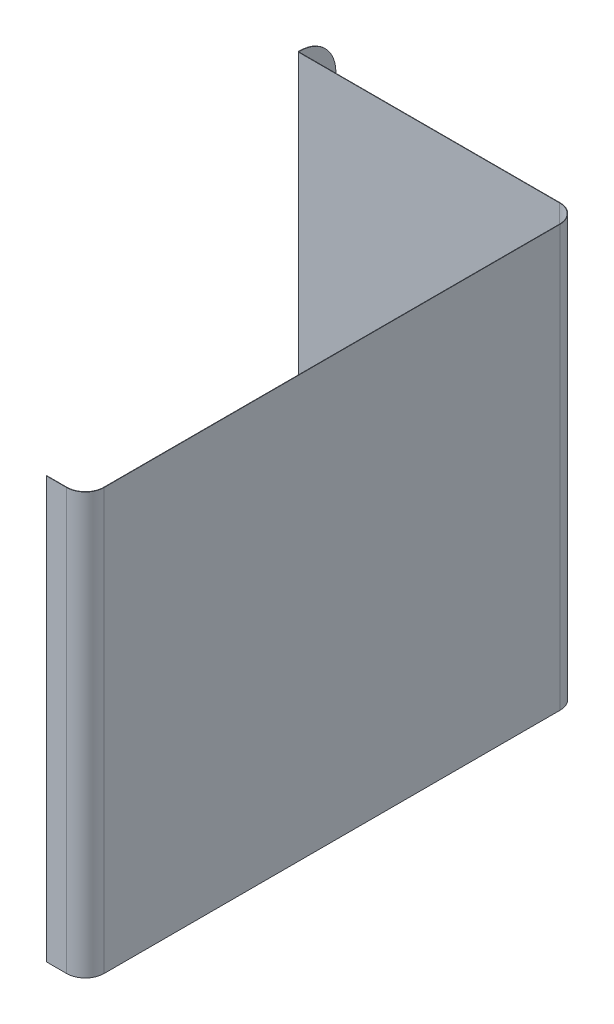
ISO-10303-21;
HEADER;
FILE_DESCRIPTION(('STEP AP214'),'2;1');
FILE_NAME('part.step','',(''),(''),'','','');
FILE_SCHEMA(('AUTOMOTIVE_DESIGN { 1 0 10303 214 1 1 1 1 }'));
ENDSEC;
DATA;
#1=APPLICATION_CONTEXT('core data for automotive mechanical design processes');
#2=APPLICATION_PROTOCOL_DEFINITION('international standard','automotive_design',2000,#1);
#3=PRODUCT_CONTEXT('',#1,'mechanical');
#4=PRODUCT('Part','Part','',(#3));
#5=PRODUCT_RELATED_PRODUCT_CATEGORY('part','',(#4));
#6=PRODUCT_DEFINITION_FORMATION('','',#4);
#7=PRODUCT_DEFINITION_CONTEXT('part definition',#1,'design');
#8=PRODUCT_DEFINITION('design','',#6,#7);
#9=PRODUCT_DEFINITION_SHAPE('','',#8);
#10=(LENGTH_UNIT() NAMED_UNIT(*) SI_UNIT(.MILLI.,.METRE.));
#11=(NAMED_UNIT(*) PLANE_ANGLE_UNIT() SI_UNIT($,.RADIAN.));
#12=(NAMED_UNIT(*) SI_UNIT($,.STERADIAN.) SOLID_ANGLE_UNIT());
#13=UNCERTAINTY_MEASURE_WITH_UNIT(LENGTH_MEASURE(1.E-05),#10,'distance_accuracy_value','');
#14=(GEOMETRIC_REPRESENTATION_CONTEXT(3) GLOBAL_UNCERTAINTY_ASSIGNED_CONTEXT((#13)) GLOBAL_UNIT_ASSIGNED_CONTEXT((#10,
#11,#12)) REPRESENTATION_CONTEXT('',''));
#15=CARTESIAN_POINT('',(0.,0.,0.));
#16=DIRECTION('',(0.,0.,1.));
#17=DIRECTION('',(1.,0.,0.));
#18=AXIS2_PLACEMENT_3D('',#15,#16,#17);
#19=CARTESIAN_POINT('',(-230.2,871.6,-382.));
#20=DIRECTION('',(-1.,0.,0.));
#21=DIRECTION('',(0.,0.,1.));
#22=AXIS2_PLACEMENT_3D('',#19,#20,#21);
#23=PLANE('',#22);
#24=CARTESIAN_POINT('',(-230.2,796.6,-385.));
#25=DIRECTION('',(-1.,0.,0.));
#26=DIRECTION('',(0.,0.,1.));
#27=AXIS2_PLACEMENT_3D('',#24,#25,#26);
#28=CIRCLE('',#27,75.);
#29=CARTESIAN_POINT('',(-230.2,796.6,-460.));
#30=VERTEX_POINT('',#29);
#31=CARTESIAN_POINT('',(-230.2,871.6,-385.));
#32=VERTEX_POINT('',#31);
#33=EDGE_CURVE('E160',#30,#32,#28,.F.);
#34=ORIENTED_EDGE('',*,*,#33,.T.);
#35=DIRECTION('',(0.,0.,-1.));
#36=VECTOR('',#35,1.);
#37=CARTESIAN_POINT('',(-230.2,871.6,-382.));
#38=LINE('',#37,#36);
#39=CARTESIAN_POINT('',(-230.2,871.6,-383.6));
#40=VERTEX_POINT('',#39);
#41=EDGE_CURVE('E173',#40,#32,#38,.T.);
#42=ORIENTED_EDGE('',*,*,#41,.F.);
#43=DIRECTION('',(0.,-1.,0.));
#44=VECTOR('',#43,1.);
#45=CARTESIAN_POINT('',(-230.2,871.6,-383.6));
#46=LINE('',#45,#44);
#47=CARTESIAN_POINT('',(-230.2,0.,-383.6));
#48=VERTEX_POINT('',#47);
#49=EDGE_CURVE('E228',#40,#48,#46,.T.);
#50=ORIENTED_EDGE('',*,*,#49,.T.);
#51=DIRECTION('',(0.,0.,-1.));
#52=VECTOR('',#51,1.);
#53=CARTESIAN_POINT('',(-230.2,0.,-382.));
#54=LINE('',#53,#52);
#55=CARTESIAN_POINT('',(-230.2,0.,-385.));
#56=VERTEX_POINT('',#55);
#57=EDGE_CURVE('E229',#48,#56,#54,.T.);
#58=ORIENTED_EDGE('',*,*,#57,.T.);
#59=CARTESIAN_POINT('',(-230.2,75.,-385.));
#60=DIRECTION('',(-1.,0.,0.));
#61=DIRECTION('',(0.,0.,1.));
#62=AXIS2_PLACEMENT_3D('',#59,#60,#61);
#63=CIRCLE('',#62,75.);
#64=CARTESIAN_POINT('',(-230.2,75.,-460.));
#65=VERTEX_POINT('',#64);
#66=EDGE_CURVE('E58',#56,#65,#63,.F.);
#67=ORIENTED_EDGE('',*,*,#66,.T.);
#68=DIRECTION('',(0.,-1.,0.));
#69=VECTOR('',#68,1.);
#70=CARTESIAN_POINT('',(-230.2,871.6,-460.));
#71=LINE('',#70,#69);
#72=EDGE_CURVE('E174',#30,#65,#71,.T.);
#73=ORIENTED_EDGE('',*,*,#72,.F.);
#74=EDGE_LOOP('',(#34,#42,#50,#58,#67,#73));
#75=FACE_BOUND('',#74,.T.);
#76=ADVANCED_FACE('F35',(#75),#23,.F.);
#77=CARTESIAN_POINT('',(-231.,871.6,-382.));
#78=DIRECTION('',(-1.,0.,0.));
#79=DIRECTION('',(0.,0.,1.));
#80=AXIS2_PLACEMENT_3D('',#77,#78,#79);
#81=PLANE('',#80);
#82=DIRECTION('',(0.,0.,-1.));
#83=VECTOR('',#82,1.);
#84=CARTESIAN_POINT('',(-231.,871.6,-382.));
#85=LINE('',#84,#83);
#86=CARTESIAN_POINT('',(-231.,871.6,-383.6));
#87=VERTEX_POINT('',#86);
#88=CARTESIAN_POINT('',(-231.,871.6,-385.));
#89=VERTEX_POINT('',#88);
#90=EDGE_CURVE('E179',#87,#89,#85,.T.);
#91=ORIENTED_EDGE('',*,*,#90,.T.);
#92=CARTESIAN_POINT('',(-231.,796.6,-385.));
#93=DIRECTION('',(-1.,0.,0.));
#94=DIRECTION('',(0.,0.,1.));
#95=AXIS2_PLACEMENT_3D('',#92,#93,#94);
#96=CIRCLE('',#95,75.);
#97=CARTESIAN_POINT('',(-231.,796.6,-460.));
#98=VERTEX_POINT('',#97);
#99=EDGE_CURVE('E50',#98,#89,#96,.F.);
#100=ORIENTED_EDGE('',*,*,#99,.F.);
#101=DIRECTION('',(0.,-1.,0.));
#102=VECTOR('',#101,1.);
#103=CARTESIAN_POINT('',(-231.,871.6,-460.));
#104=LINE('',#103,#102);
#105=CARTESIAN_POINT('',(-231.,75.,-460.));
#106=VERTEX_POINT('',#105);
#107=EDGE_CURVE('E309',#98,#106,#104,.T.);
#108=ORIENTED_EDGE('',*,*,#107,.T.);
#109=CARTESIAN_POINT('',(-231.,75.,-385.));
#110=DIRECTION('',(-1.,0.,0.));
#111=DIRECTION('',(0.,0.,1.));
#112=AXIS2_PLACEMENT_3D('',#109,#110,#111);
#113=CIRCLE('',#112,75.);
#114=CARTESIAN_POINT('',(-231.,0.,-385.));
#115=VERTEX_POINT('',#114);
#116=EDGE_CURVE('E166',#115,#106,#113,.F.);
#117=ORIENTED_EDGE('',*,*,#116,.F.);
#118=DIRECTION('',(0.,0.,-1.));
#119=VECTOR('',#118,1.);
#120=CARTESIAN_POINT('',(-231.,0.,-382.));
#121=LINE('',#120,#119);
#122=CARTESIAN_POINT('',(-231.,0.,-383.6));
#123=VERTEX_POINT('',#122);
#124=EDGE_CURVE('E232',#123,#115,#121,.T.);
#125=ORIENTED_EDGE('',*,*,#124,.F.);
#126=DIRECTION('',(0.,-1.,0.));
#127=VECTOR('',#126,1.);
#128=CARTESIAN_POINT('',(-231.,871.6,-383.6));
#129=LINE('',#128,#127);
#130=EDGE_CURVE('E306',#87,#123,#129,.T.);
#131=ORIENTED_EDGE('',*,*,#130,.F.);
#132=EDGE_LOOP('',(#91,#100,#108,#117,#125,#131));
#133=FACE_BOUND('',#132,.T.);
#134=ADVANCED_FACE('F388',(#133),#81,.T.);
#135=CARTESIAN_POINT('',(-229.4,871.6,-382.8));
#136=DIRECTION('',(0.,1.,0.));
#137=DIRECTION('',(0.,0.,1.));
#138=AXIS2_PLACEMENT_3D('',#135,#136,#137);
#139=PLANE('',#138);
#140=ORIENTED_EDGE('',*,*,#41,.T.);
#141=DIRECTION('',(-1.,0.,0.));
#142=VECTOR('',#141,1.);
#143=CARTESIAN_POINT('',(-231.,871.6,-385.));
#144=LINE('',#143,#142);
#145=EDGE_CURVE('E157',#89,#32,#144,.F.);
#146=ORIENTED_EDGE('',*,*,#145,.F.);
#147=ORIENTED_EDGE('',*,*,#90,.F.);
#148=DIRECTION('',(1.,0.,0.));
#149=VECTOR('',#148,1.);
#150=CARTESIAN_POINT('',(-231.,871.6,-383.6));
#151=LINE('',#150,#149);
#152=EDGE_CURVE('E177',#87,#40,#151,.T.);
#153=ORIENTED_EDGE('',*,*,#152,.T.);
#154=EDGE_LOOP('',(#140,#146,#147,#153));
#155=FACE_BOUND('',#154,.T.);
#156=ADVANCED_FACE('F176',(#155),#139,.T.);
#157=CARTESIAN_POINT('',(-231.,871.6,-460.));
#158=DIRECTION('',(0.,0.,-1.));
#159=DIRECTION('',(-1.,0.,0.));
#160=AXIS2_PLACEMENT_3D('',#157,#158,#159);
#161=PLANE('',#160);
#162=DIRECTION('',(-1.,0.,0.));
#163=VECTOR('',#162,1.);
#164=CARTESIAN_POINT('',(-231.,796.6,-460.));
#165=LINE('',#164,#163);
#166=EDGE_CURVE('E167',#98,#30,#165,.F.);
#167=ORIENTED_EDGE('',*,*,#166,.T.);
#168=ORIENTED_EDGE('',*,*,#72,.T.);
#169=DIRECTION('',(-1.,0.,0.));
#170=VECTOR('',#169,1.);
#171=CARTESIAN_POINT('',(-231.,75.,-460.));
#172=LINE('',#171,#170);
#173=EDGE_CURVE('E233',#106,#65,#172,.F.);
#174=ORIENTED_EDGE('',*,*,#173,.F.);
#175=ORIENTED_EDGE('',*,*,#107,.F.);
#176=EDGE_LOOP('',(#167,#168,#174,#175));
#177=FACE_BOUND('',#176,.T.);
#178=ADVANCED_FACE('F398',(#177),#161,.T.);
#179=CARTESIAN_POINT('',(-229.4,0.,-383.6));
#180=DIRECTION('',(0.,1.,0.));
#181=DIRECTION('',(1.,0.,0.));
#182=AXIS2_PLACEMENT_3D('',#179,#180,#181);
#183=PLANE('',#182);
#184=DIRECTION('',(-1.,0.,0.));
#185=VECTOR('',#184,1.);
#186=CARTESIAN_POINT('',(-231.,0.,-385.));
#187=LINE('',#186,#185);
#188=EDGE_CURVE('E188',#115,#56,#187,.F.);
#189=ORIENTED_EDGE('',*,*,#188,.T.);
#190=ORIENTED_EDGE('',*,*,#57,.F.);
#191=DIRECTION('',(-1.,0.,0.));
#192=VECTOR('',#191,1.);
#193=CARTESIAN_POINT('',(-230.2,0.,-383.6));
#194=LINE('',#193,#192);
#195=EDGE_CURVE('E312',#48,#123,#194,.T.);
#196=ORIENTED_EDGE('',*,*,#195,.T.);
#197=ORIENTED_EDGE('',*,*,#124,.T.);
#198=EDGE_LOOP('',(#189,#190,#196,#197));
#199=FACE_BOUND('',#198,.T.);
#200=ADVANCED_FACE('F455',(#199),#183,.F.);
#201=CARTESIAN_POINT('',(349.,871.6,600.));
#202=DIRECTION('',(0.,1.,0.));
#203=DIRECTION('',(0.,0.,1.));
#204=AXIS2_PLACEMENT_3D('',#201,#202,#203);
#205=PLANE('',#204);
#206=DIRECTION('',(1.,0.,0.));
#207=VECTOR('',#206,1.);
#208=CARTESIAN_POINT('',(349.,871.6,600.));
#209=LINE('',#208,#207);
#210=CARTESIAN_POINT('',(349.,871.6,600.));
#211=VERTEX_POINT('',#210);
#212=CARTESIAN_POINT('',(349.8,871.6,600.));
#213=VERTEX_POINT('',#212);
#214=EDGE_CURVE('E11',#211,#213,#209,.T.);
#215=ORIENTED_EDGE('',*,*,#214,.F.);
#216=CARTESIAN_POINT('',(311.,871.6,600.));
#217=DIRECTION('',(0.,1.,0.));
#218=DIRECTION('',(0.,0.,1.));
#219=AXIS2_PLACEMENT_3D('',#216,#217,#218);
#220=CIRCLE('',#219,38.);
#221=CARTESIAN_POINT('',(311.,871.6,638.));
#222=VERTEX_POINT('',#221);
#223=EDGE_CURVE('E202',#222,#211,#220,.T.);
#224=ORIENTED_EDGE('',*,*,#223,.F.);
#225=DIRECTION('',(0.,0.,-1.));
#226=VECTOR('',#225,1.);
#227=CARTESIAN_POINT('',(311.,871.6,638.8));
#228=LINE('',#227,#226);
#229=CARTESIAN_POINT('',(311.,871.6,638.8));
#230=VERTEX_POINT('',#229);
#231=EDGE_CURVE('E43',#230,#222,#228,.T.);
#232=ORIENTED_EDGE('',*,*,#231,.F.);
#233=CARTESIAN_POINT('',(311.,871.6,600.));
#234=DIRECTION('',(0.,1.,0.));
#235=DIRECTION('',(1.,0.,0.));
#236=AXIS2_PLACEMENT_3D('',#233,#234,#235);
#237=CIRCLE('',#236,38.8);
#238=EDGE_CURVE('E214',#230,#213,#237,.T.);
#239=ORIENTED_EDGE('',*,*,#238,.T.);
#240=EDGE_LOOP('',(#215,#224,#232,#239));
#241=FACE_BOUND('',#240,.T.);
#242=ADVANCED_FACE('F37',(#241),#205,.T.);
#243=CARTESIAN_POINT('',(311.,871.6,638.8));
#244=DIRECTION('',(0.,1.,0.));
#245=DIRECTION('',(0.,0.,1.));
#246=AXIS2_PLACEMENT_3D('',#243,#244,#245);
#247=PLANE('',#246);
#248=DIRECTION('',(0.,0.,-1.));
#249=VECTOR('',#248,1.);
#250=CARTESIAN_POINT('',(349.,871.6,600.));
#251=LINE('',#250,#249);
#252=CARTESIAN_POINT('',(349.,871.6,-344.));
#253=VERTEX_POINT('',#252);
#254=EDGE_CURVE('E199',#211,#253,#251,.T.);
#255=ORIENTED_EDGE('',*,*,#254,.F.);
#256=ORIENTED_EDGE('',*,*,#214,.T.);
#257=DIRECTION('',(0.,0.,-1.));
#258=VECTOR('',#257,1.);
#259=CARTESIAN_POINT('',(349.8,871.6,600.));
#260=LINE('',#259,#258);
#261=CARTESIAN_POINT('',(349.8,871.6,-344.));
#262=VERTEX_POINT('',#261);
#263=EDGE_CURVE('E217',#213,#262,#260,.T.);
#264=ORIENTED_EDGE('',*,*,#263,.T.);
#265=DIRECTION('',(-1.,0.,0.));
#266=VECTOR('',#265,1.);
#267=CARTESIAN_POINT('',(349.8,871.6,-344.));
#268=LINE('',#267,#266);
#269=EDGE_CURVE('E323',#262,#253,#268,.T.);
#270=ORIENTED_EDGE('',*,*,#269,.T.);
#271=EDGE_LOOP('',(#255,#256,#264,#270));
#272=FACE_BOUND('',#271,.T.);
#273=ADVANCED_FACE('F365',(#272),#247,.T.);
#274=CARTESIAN_POINT('',(311.,0.,638.));
#275=DIRECTION('',(0.,-1.,0.));
#276=DIRECTION('',(0.,0.,-1.));
#277=AXIS2_PLACEMENT_3D('',#274,#275,#276);
#278=PLANE('',#277);
#279=DIRECTION('',(0.,0.,1.));
#280=VECTOR('',#279,1.);
#281=CARTESIAN_POINT('',(311.,0.,638.));
#282=LINE('',#281,#280);
#283=CARTESIAN_POINT('',(311.,0.,638.));
#284=VERTEX_POINT('',#283);
#285=CARTESIAN_POINT('',(311.,0.,638.8));
#286=VERTEX_POINT('',#285);
#287=EDGE_CURVE('E329',#284,#286,#282,.T.);
#288=ORIENTED_EDGE('',*,*,#287,.F.);
#289=CARTESIAN_POINT('',(311.,0.,600.));
#290=DIRECTION('',(0.,1.,0.));
#291=DIRECTION('',(0.,0.,1.));
#292=AXIS2_PLACEMENT_3D('',#289,#290,#291);
#293=CIRCLE('',#292,38.);
#294=CARTESIAN_POINT('',(349.,0.,600.));
#295=VERTEX_POINT('',#294);
#296=EDGE_CURVE('E248',#284,#295,#293,.T.);
#297=ORIENTED_EDGE('',*,*,#296,.T.);
#298=DIRECTION('',(-1.,0.,0.));
#299=VECTOR('',#298,1.);
#300=CARTESIAN_POINT('',(349.8,0.,600.));
#301=LINE('',#300,#299);
#302=CARTESIAN_POINT('',(349.8,0.,600.));
#303=VERTEX_POINT('',#302);
#304=EDGE_CURVE('E327',#303,#295,#301,.T.);
#305=ORIENTED_EDGE('',*,*,#304,.F.);
#306=CARTESIAN_POINT('',(311.,0.,600.));
#307=DIRECTION('',(0.,1.,0.));
#308=DIRECTION('',(1.,0.,0.));
#309=AXIS2_PLACEMENT_3D('',#306,#307,#308);
#310=CIRCLE('',#309,38.8);
#311=EDGE_CURVE('E260',#286,#303,#310,.T.);
#312=ORIENTED_EDGE('',*,*,#311,.F.);
#313=EDGE_LOOP('',(#288,#297,#305,#312));
#314=FACE_BOUND('',#313,.T.);
#315=ADVANCED_FACE('F373',(#314),#278,.T.);
#316=CARTESIAN_POINT('',(349.8,0.,600.));
#317=DIRECTION('',(0.,-1.,0.));
#318=DIRECTION('',(0.,0.,-1.));
#319=AXIS2_PLACEMENT_3D('',#316,#317,#318);
#320=PLANE('',#319);
#321=DIRECTION('',(1.,0.,0.));
#322=VECTOR('',#321,1.);
#323=CARTESIAN_POINT('',(311.,0.,638.));
#324=LINE('',#323,#322);
#325=CARTESIAN_POINT('',(269.,0.,638.));
#326=VERTEX_POINT('',#325);
#327=EDGE_CURVE('E251',#326,#284,#324,.T.);
#328=ORIENTED_EDGE('',*,*,#327,.T.);
#329=ORIENTED_EDGE('',*,*,#287,.T.);
#330=DIRECTION('',(1.,0.,0.));
#331=VECTOR('',#330,1.);
#332=CARTESIAN_POINT('',(311.,0.,638.8));
#333=LINE('',#332,#331);
#334=CARTESIAN_POINT('',(269.,0.,638.8));
#335=VERTEX_POINT('',#334);
#336=EDGE_CURVE('E257',#335,#286,#333,.T.);
#337=ORIENTED_EDGE('',*,*,#336,.F.);
#338=DIRECTION('',(0.,0.,-1.));
#339=VECTOR('',#338,1.);
#340=CARTESIAN_POINT('',(269.,0.,638.8));
#341=LINE('',#340,#339);
#342=EDGE_CURVE('E254',#335,#326,#341,.T.);
#343=ORIENTED_EDGE('',*,*,#342,.T.);
#344=EDGE_LOOP('',(#328,#329,#337,#343));
#345=FACE_BOUND('',#344,.T.);
#346=ADVANCED_FACE('F375',(#345),#320,.T.);
#347=CARTESIAN_POINT('',(311.,871.6,-382.));
#348=DIRECTION('',(0.,1.,0.));
#349=DIRECTION('',(0.,0.,1.));
#350=AXIS2_PLACEMENT_3D('',#347,#348,#349);
#351=PLANE('',#350);
#352=DIRECTION('',(0.,0.,-1.));
#353=VECTOR('',#352,1.);
#354=CARTESIAN_POINT('',(311.,871.6,-382.));
#355=LINE('',#354,#353);
#356=CARTESIAN_POINT('',(311.,871.6,-382.));
#357=VERTEX_POINT('',#356);
#358=CARTESIAN_POINT('',(311.,871.6,-382.8));
#359=VERTEX_POINT('',#358);
#360=EDGE_CURVE('E325',#357,#359,#355,.T.);
#361=ORIENTED_EDGE('',*,*,#360,.F.);
#362=CARTESIAN_POINT('',(311.,871.6,-344.));
#363=DIRECTION('',(0.,1.,0.));
#364=DIRECTION('',(0.,0.,-1.));
#365=AXIS2_PLACEMENT_3D('',#362,#363,#364);
#366=CIRCLE('',#365,38.);
#367=EDGE_CURVE('E196',#253,#357,#366,.T.);
#368=ORIENTED_EDGE('',*,*,#367,.F.);
#369=ORIENTED_EDGE('',*,*,#269,.F.);
#370=CARTESIAN_POINT('',(311.,871.6,-344.));
#371=DIRECTION('',(0.,1.,0.));
#372=DIRECTION('',(1.,0.,0.));
#373=AXIS2_PLACEMENT_3D('',#370,#371,#372);
#374=CIRCLE('',#373,38.8);
#375=EDGE_CURVE('E220',#262,#359,#374,.T.);
#376=ORIENTED_EDGE('',*,*,#375,.T.);
#377=EDGE_LOOP('',(#361,#368,#369,#376));
#378=FACE_BOUND('',#377,.T.);
#379=ADVANCED_FACE('F377',(#378),#351,.T.);
#380=CARTESIAN_POINT('',(349.8,871.6,-344.));
#381=DIRECTION('',(0.,1.,0.));
#382=DIRECTION('',(0.,0.,1.));
#383=AXIS2_PLACEMENT_3D('',#380,#381,#382);
#384=PLANE('',#383);
#385=DIRECTION('',(-1.,0.,0.));
#386=VECTOR('',#385,1.);
#387=CARTESIAN_POINT('',(-231.,871.6,-382.));
#388=LINE('',#387,#386);
#389=CARTESIAN_POINT('',(-229.4,871.6,-382.));
#390=VERTEX_POINT('',#389);
#391=EDGE_CURVE('E193',#357,#390,#388,.T.);
#392=ORIENTED_EDGE('',*,*,#391,.F.);
#393=ORIENTED_EDGE('',*,*,#360,.T.);
#394=DIRECTION('',(1.,0.,0.));
#395=VECTOR('',#394,1.);
#396=CARTESIAN_POINT('',(-231.,871.6,-382.8));
#397=LINE('',#396,#395);
#398=CARTESIAN_POINT('',(-229.4,871.6,-382.8));
#399=VERTEX_POINT('',#398);
#400=EDGE_CURVE('E223',#359,#399,#397,.F.);
#401=ORIENTED_EDGE('',*,*,#400,.T.);
#402=DIRECTION('',(0.,0.,1.));
#403=VECTOR('',#402,1.);
#404=CARTESIAN_POINT('',(-229.4,871.6,-382.8));
#405=LINE('',#404,#403);
#406=EDGE_CURVE('E316',#399,#390,#405,.T.);
#407=ORIENTED_EDGE('',*,*,#406,.T.);
#408=EDGE_LOOP('',(#392,#393,#401,#407));
#409=FACE_BOUND('',#408,.T.);
#410=ADVANCED_FACE('F383',(#409),#384,.T.);
#411=CARTESIAN_POINT('',(349.,0.,-344.));
#412=DIRECTION('',(0.,-1.,0.));
#413=DIRECTION('',(0.,0.,-1.));
#414=AXIS2_PLACEMENT_3D('',#411,#412,#413);
#415=PLANE('',#414);
#416=DIRECTION('',(1.,0.,0.));
#417=VECTOR('',#416,1.);
#418=CARTESIAN_POINT('',(349.,0.,-344.));
#419=LINE('',#418,#417);
#420=CARTESIAN_POINT('',(349.,0.,-344.));
#421=VERTEX_POINT('',#420);
#422=CARTESIAN_POINT('',(349.8,0.,-344.));
#423=VERTEX_POINT('',#422);
#424=EDGE_CURVE('E321',#421,#423,#419,.T.);
#425=ORIENTED_EDGE('',*,*,#424,.F.);
#426=CARTESIAN_POINT('',(311.,0.,-344.));
#427=DIRECTION('',(0.,1.,0.));
#428=DIRECTION('',(0.,0.,-1.));
#429=AXIS2_PLACEMENT_3D('',#426,#427,#428);
#430=CIRCLE('',#429,38.);
#431=CARTESIAN_POINT('',(311.,0.,-382.));
#432=VERTEX_POINT('',#431);
#433=EDGE_CURVE('E242',#421,#432,#430,.T.);
#434=ORIENTED_EDGE('',*,*,#433,.T.);
#435=DIRECTION('',(0.,0.,1.));
#436=VECTOR('',#435,1.);
#437=CARTESIAN_POINT('',(311.,0.,-382.8));
#438=LINE('',#437,#436);
#439=CARTESIAN_POINT('',(311.,0.,-382.8));
#440=VERTEX_POINT('',#439);
#441=EDGE_CURVE('E319',#440,#432,#438,.T.);
#442=ORIENTED_EDGE('',*,*,#441,.F.);
#443=CARTESIAN_POINT('',(311.,0.,-344.));
#444=DIRECTION('',(0.,1.,0.));
#445=DIRECTION('',(1.,0.,0.));
#446=AXIS2_PLACEMENT_3D('',#443,#444,#445);
#447=CIRCLE('',#446,38.8);
#448=EDGE_CURVE('E266',#423,#440,#447,.T.);
#449=ORIENTED_EDGE('',*,*,#448,.F.);
#450=EDGE_LOOP('',(#425,#434,#442,#449));
#451=FACE_BOUND('',#450,.T.);
#452=ADVANCED_FACE('F417',(#451),#415,.T.);
#453=CARTESIAN_POINT('',(311.,0.,-382.8));
#454=DIRECTION('',(0.,-1.,0.));
#455=DIRECTION('',(0.,0.,-1.));
#456=AXIS2_PLACEMENT_3D('',#453,#454,#455);
#457=PLANE('',#456);
#458=DIRECTION('',(0.,0.,-1.));
#459=VECTOR('',#458,1.);
#460=CARTESIAN_POINT('',(349.,0.,600.));
#461=LINE('',#460,#459);
#462=EDGE_CURVE('E245',#295,#421,#461,.T.);
#463=ORIENTED_EDGE('',*,*,#462,.T.);
#464=ORIENTED_EDGE('',*,*,#424,.T.);
#465=DIRECTION('',(0.,0.,-1.));
#466=VECTOR('',#465,1.);
#467=CARTESIAN_POINT('',(349.8,0.,600.));
#468=LINE('',#467,#466);
#469=EDGE_CURVE('E263',#303,#423,#468,.T.);
#470=ORIENTED_EDGE('',*,*,#469,.F.);
#471=ORIENTED_EDGE('',*,*,#304,.T.);
#472=EDGE_LOOP('',(#463,#464,#470,#471));
#473=FACE_BOUND('',#472,.T.);
#474=ADVANCED_FACE('F413',(#473),#457,.T.);
#475=CARTESIAN_POINT('',(-231.,871.6,-383.6));
#476=DIRECTION('',(0.,1.,0.));
#477=DIRECTION('',(0.,0.,1.));
#478=AXIS2_PLACEMENT_3D('',#475,#476,#477);
#479=PLANE('',#478);
#480=ORIENTED_EDGE('',*,*,#152,.F.);
#481=CARTESIAN_POINT('',(-229.4,871.6,-383.6));
#482=DIRECTION('',(0.,1.,0.));
#483=DIRECTION('',(0.,0.,1.));
#484=AXIS2_PLACEMENT_3D('',#481,#482,#483);
#485=CIRCLE('',#484,1.6);
#486=EDGE_CURVE('E182',#390,#87,#485,.F.);
#487=ORIENTED_EDGE('',*,*,#486,.F.);
#488=ORIENTED_EDGE('',*,*,#406,.F.);
#489=CARTESIAN_POINT('',(-229.4,871.6,-383.6));
#490=DIRECTION('',(0.,1.,0.));
#491=DIRECTION('',(1.,0.,0.));
#492=AXIS2_PLACEMENT_3D('',#489,#490,#491);
#493=CIRCLE('',#492,0.8);
#494=EDGE_CURVE('E226',#399,#40,#493,.F.);
#495=ORIENTED_EDGE('',*,*,#494,.T.);
#496=EDGE_LOOP('',(#480,#487,#488,#495));
#497=FACE_BOUND('',#496,.T.);
#498=ADVANCED_FACE('F407',(#497),#479,.T.);
#499=CARTESIAN_POINT('',(-229.4,0.,-382.));
#500=DIRECTION('',(0.,-1.,0.));
#501=DIRECTION('',(0.,0.,-1.));
#502=AXIS2_PLACEMENT_3D('',#499,#500,#501);
#503=PLANE('',#502);
#504=DIRECTION('',(0.,0.,-1.));
#505=VECTOR('',#504,1.);
#506=CARTESIAN_POINT('',(-229.4,0.,-382.));
#507=LINE('',#506,#505);
#508=CARTESIAN_POINT('',(-229.4,0.,-382.));
#509=VERTEX_POINT('',#508);
#510=CARTESIAN_POINT('',(-229.4,0.,-382.8));
#511=VERTEX_POINT('',#510);
#512=EDGE_CURVE('E314',#509,#511,#507,.T.);
#513=ORIENTED_EDGE('',*,*,#512,.F.);
#514=CARTESIAN_POINT('',(-229.4,0.,-383.6));
#515=DIRECTION('',(0.,1.,0.));
#516=DIRECTION('',(0.,0.,1.));
#517=AXIS2_PLACEMENT_3D('',#514,#515,#516);
#518=CIRCLE('',#517,1.6);
#519=EDGE_CURVE('E236',#509,#123,#518,.F.);
#520=ORIENTED_EDGE('',*,*,#519,.T.);
#521=ORIENTED_EDGE('',*,*,#195,.F.);
#522=CARTESIAN_POINT('',(-229.4,0.,-383.6));
#523=DIRECTION('',(0.,1.,0.));
#524=DIRECTION('',(1.,0.,0.));
#525=AXIS2_PLACEMENT_3D('',#522,#523,#524);
#526=CIRCLE('',#525,0.8);
#527=EDGE_CURVE('E180',#511,#48,#526,.F.);
#528=ORIENTED_EDGE('',*,*,#527,.F.);
#529=EDGE_LOOP('',(#513,#520,#521,#528));
#530=FACE_BOUND('',#529,.T.);
#531=ADVANCED_FACE('F403',(#530),#503,.T.);
#532=CARTESIAN_POINT('',(-230.2,0.,-383.6));
#533=DIRECTION('',(0.,-1.,0.));
#534=DIRECTION('',(0.,0.,-1.));
#535=AXIS2_PLACEMENT_3D('',#532,#533,#534);
#536=PLANE('',#535);
#537=DIRECTION('',(-1.,0.,0.));
#538=VECTOR('',#537,1.);
#539=CARTESIAN_POINT('',(-231.,0.,-382.));
#540=LINE('',#539,#538);
#541=EDGE_CURVE('E239',#432,#509,#540,.T.);
#542=ORIENTED_EDGE('',*,*,#541,.T.);
#543=ORIENTED_EDGE('',*,*,#512,.T.);
#544=DIRECTION('',(1.,0.,0.));
#545=VECTOR('',#544,1.);
#546=CARTESIAN_POINT('',(-231.,0.,-382.8));
#547=LINE('',#546,#545);
#548=EDGE_CURVE('E185',#440,#511,#547,.F.);
#549=ORIENTED_EDGE('',*,*,#548,.F.);
#550=ORIENTED_EDGE('',*,*,#441,.T.);
#551=EDGE_LOOP('',(#542,#543,#549,#550));
#552=FACE_BOUND('',#551,.T.);
#553=ADVANCED_FACE('F399',(#552),#536,.T.);
#554=CARTESIAN_POINT('',(-229.4,871.6,-383.6));
#555=DIRECTION('',(0.,-1.,0.));
#556=DIRECTION('',(0.,0.,-1.));
#557=AXIS2_PLACEMENT_3D('',#554,#555,#556);
#558=CYLINDRICAL_SURFACE('',#557,1.6);
#559=ORIENTED_EDGE('',*,*,#519,.F.);
#560=DIRECTION('',(0.,-1.,0.));
#561=VECTOR('',#560,1.);
#562=CARTESIAN_POINT('',(-229.4,871.6,-382.));
#563=LINE('',#562,#561);
#564=EDGE_CURVE('E303',#390,#509,#563,.T.);
#565=ORIENTED_EDGE('',*,*,#564,.F.);
#566=ORIENTED_EDGE('',*,*,#486,.T.);
#567=ORIENTED_EDGE('',*,*,#130,.T.);
#568=EDGE_LOOP('',(#559,#565,#566,#567));
#569=FACE_BOUND('',#568,.T.);
#570=ADVANCED_FACE('F402',(#569),#558,.T.);
#571=CARTESIAN_POINT('',(-231.,871.6,-382.));
#572=DIRECTION('',(0.,0.,1.));
#573=DIRECTION('',(1.,0.,0.));
#574=AXIS2_PLACEMENT_3D('',#571,#572,#573);
#575=PLANE('',#574);
#576=ORIENTED_EDGE('',*,*,#541,.F.);
#577=DIRECTION('',(0.,-1.,0.));
#578=VECTOR('',#577,1.);
#579=CARTESIAN_POINT('',(311.,871.6,-382.));
#580=LINE('',#579,#578);
#581=EDGE_CURVE('E300',#357,#432,#580,.T.);
#582=ORIENTED_EDGE('',*,*,#581,.F.);
#583=ORIENTED_EDGE('',*,*,#391,.T.);
#584=ORIENTED_EDGE('',*,*,#564,.T.);
#585=EDGE_LOOP('',(#576,#582,#583,#584));
#586=FACE_BOUND('',#585,.T.);
#587=ADVANCED_FACE('F434',(#586),#575,.T.);
#588=CARTESIAN_POINT('',(311.,871.6,-344.));
#589=DIRECTION('',(0.,-1.,0.));
#590=DIRECTION('',(0.,0.,-1.));
#591=AXIS2_PLACEMENT_3D('',#588,#589,#590);
#592=CYLINDRICAL_SURFACE('',#591,38.);
#593=ORIENTED_EDGE('',*,*,#433,.F.);
#594=DIRECTION('',(0.,-1.,0.));
#595=VECTOR('',#594,1.);
#596=CARTESIAN_POINT('',(349.,871.6,-344.));
#597=LINE('',#596,#595);
#598=EDGE_CURVE('E297',#253,#421,#597,.T.);
#599=ORIENTED_EDGE('',*,*,#598,.F.);
#600=ORIENTED_EDGE('',*,*,#367,.T.);
#601=ORIENTED_EDGE('',*,*,#581,.T.);
#602=EDGE_LOOP('',(#593,#599,#600,#601));
#603=FACE_BOUND('',#602,.T.);
#604=ADVANCED_FACE('F431',(#603),#592,.F.);
#605=CARTESIAN_POINT('',(349.,871.6,600.));
#606=DIRECTION('',(-1.,0.,0.));
#607=DIRECTION('',(0.,0.,1.));
#608=AXIS2_PLACEMENT_3D('',#605,#606,#607);
#609=PLANE('',#608);
#610=ORIENTED_EDGE('',*,*,#462,.F.);
#611=DIRECTION('',(0.,-1.,0.));
#612=VECTOR('',#611,1.);
#613=CARTESIAN_POINT('',(349.,871.6,600.));
#614=LINE('',#613,#612);
#615=EDGE_CURVE('E294',#211,#295,#614,.T.);
#616=ORIENTED_EDGE('',*,*,#615,.F.);
#617=ORIENTED_EDGE('',*,*,#254,.T.);
#618=ORIENTED_EDGE('',*,*,#598,.T.);
#619=EDGE_LOOP('',(#610,#616,#617,#618));
#620=FACE_BOUND('',#619,.T.);
#621=ADVANCED_FACE('F369',(#620),#609,.T.);
#622=CARTESIAN_POINT('',(311.,871.6,600.));
#623=DIRECTION('',(0.,-1.,0.));
#624=DIRECTION('',(0.,0.,-1.));
#625=AXIS2_PLACEMENT_3D('',#622,#623,#624);
#626=CYLINDRICAL_SURFACE('',#625,38.);
#627=ORIENTED_EDGE('',*,*,#296,.F.);
#628=DIRECTION('',(0.,-1.,0.));
#629=VECTOR('',#628,1.);
#630=CARTESIAN_POINT('',(311.,871.6,638.));
#631=LINE('',#630,#629);
#632=EDGE_CURVE('E291',#222,#284,#631,.T.);
#633=ORIENTED_EDGE('',*,*,#632,.F.);
#634=ORIENTED_EDGE('',*,*,#223,.T.);
#635=ORIENTED_EDGE('',*,*,#615,.T.);
#636=EDGE_LOOP('',(#627,#633,#634,#635));
#637=FACE_BOUND('',#636,.T.);
#638=ADVANCED_FACE('F341',(#637),#626,.F.);
#639=CARTESIAN_POINT('',(311.,871.6,638.));
#640=DIRECTION('',(0.,0.,-1.));
#641=DIRECTION('',(-1.,0.,0.));
#642=AXIS2_PLACEMENT_3D('',#639,#640,#641);
#643=PLANE('',#642);
#644=ORIENTED_EDGE('',*,*,#327,.F.);
#645=DIRECTION('',(0.,-1.,0.));
#646=VECTOR('',#645,1.);
#647=CARTESIAN_POINT('',(269.,871.6,638.));
#648=LINE('',#647,#646);
#649=CARTESIAN_POINT('',(269.,871.6,638.));
#650=VERTEX_POINT('',#649);
#651=EDGE_CURVE('E289',#650,#326,#648,.T.);
#652=ORIENTED_EDGE('',*,*,#651,.F.);
#653=DIRECTION('',(1.,0.,0.));
#654=VECTOR('',#653,1.);
#655=CARTESIAN_POINT('',(311.,871.6,638.));
#656=LINE('',#655,#654);
#657=EDGE_CURVE('E205',#650,#222,#656,.T.);
#658=ORIENTED_EDGE('',*,*,#657,.T.);
#659=ORIENTED_EDGE('',*,*,#632,.T.);
#660=EDGE_LOOP('',(#644,#652,#658,#659));
#661=FACE_BOUND('',#660,.T.);
#662=ADVANCED_FACE('F345',(#661),#643,.T.);
#663=CARTESIAN_POINT('',(269.,871.6,638.8));
#664=DIRECTION('',(-1.,0.,0.));
#665=DIRECTION('',(0.,0.,1.));
#666=AXIS2_PLACEMENT_3D('',#663,#664,#665);
#667=PLANE('',#666);
#668=ORIENTED_EDGE('',*,*,#342,.F.);
#669=DIRECTION('',(0.,-1.,0.));
#670=VECTOR('',#669,1.);
#671=CARTESIAN_POINT('',(269.,871.6,638.8));
#672=LINE('',#671,#670);
#673=CARTESIAN_POINT('',(269.,871.6,638.8));
#674=VERTEX_POINT('',#673);
#675=EDGE_CURVE('E287',#674,#335,#672,.T.);
#676=ORIENTED_EDGE('',*,*,#675,.F.);
#677=DIRECTION('',(0.,0.,-1.));
#678=VECTOR('',#677,1.);
#679=CARTESIAN_POINT('',(269.,871.6,638.8));
#680=LINE('',#679,#678);
#681=EDGE_CURVE('E208',#674,#650,#680,.T.);
#682=ORIENTED_EDGE('',*,*,#681,.T.);
#683=ORIENTED_EDGE('',*,*,#651,.T.);
#684=EDGE_LOOP('',(#668,#676,#682,#683));
#685=FACE_BOUND('',#684,.T.);
#686=ADVANCED_FACE('F348',(#685),#667,.T.);
#687=CARTESIAN_POINT('',(311.,871.6,638.8));
#688=DIRECTION('',(0.,0.,-1.));
#689=DIRECTION('',(-1.,0.,0.));
#690=AXIS2_PLACEMENT_3D('',#687,#688,#689);
#691=PLANE('',#690);
#692=ORIENTED_EDGE('',*,*,#336,.T.);
#693=DIRECTION('',(0.,-1.,0.));
#694=VECTOR('',#693,1.);
#695=CARTESIAN_POINT('',(311.,871.6,638.8));
#696=LINE('',#695,#694);
#697=EDGE_CURVE('E284',#230,#286,#696,.T.);
#698=ORIENTED_EDGE('',*,*,#697,.F.);
#699=DIRECTION('',(1.,0.,0.));
#700=VECTOR('',#699,1.);
#701=CARTESIAN_POINT('',(311.,871.6,638.8));
#702=LINE('',#701,#700);
#703=EDGE_CURVE('E211',#674,#230,#702,.T.);
#704=ORIENTED_EDGE('',*,*,#703,.F.);
#705=ORIENTED_EDGE('',*,*,#675,.T.);
#706=EDGE_LOOP('',(#692,#698,#704,#705));
#707=FACE_BOUND('',#706,.T.);
#708=ADVANCED_FACE('F351',(#707),#691,.F.);
#709=CARTESIAN_POINT('',(311.,871.6,600.));
#710=DIRECTION('',(0.,-1.,0.));
#711=DIRECTION('',(0.,0.,-1.));
#712=AXIS2_PLACEMENT_3D('',#709,#710,#711);
#713=CYLINDRICAL_SURFACE('',#712,38.8);
#714=ORIENTED_EDGE('',*,*,#311,.T.);
#715=DIRECTION('',(0.,-1.,0.));
#716=VECTOR('',#715,1.);
#717=CARTESIAN_POINT('',(349.8,871.6,600.));
#718=LINE('',#717,#716);
#719=EDGE_CURVE('E281',#213,#303,#718,.T.);
#720=ORIENTED_EDGE('',*,*,#719,.F.);
#721=ORIENTED_EDGE('',*,*,#238,.F.);
#722=ORIENTED_EDGE('',*,*,#697,.T.);
#723=EDGE_LOOP('',(#714,#720,#721,#722));
#724=FACE_BOUND('',#723,.T.);
#725=ADVANCED_FACE('F356',(#724),#713,.T.);
#726=CARTESIAN_POINT('',(349.8,871.6,600.));
#727=DIRECTION('',(-1.,0.,0.));
#728=DIRECTION('',(0.,0.,1.));
#729=AXIS2_PLACEMENT_3D('',#726,#727,#728);
#730=PLANE('',#729);
#731=ORIENTED_EDGE('',*,*,#469,.T.);
#732=DIRECTION('',(0.,-1.,0.));
#733=VECTOR('',#732,1.);
#734=CARTESIAN_POINT('',(349.8,871.6,-344.));
#735=LINE('',#734,#733);
#736=EDGE_CURVE('E278',#262,#423,#735,.T.);
#737=ORIENTED_EDGE('',*,*,#736,.F.);
#738=ORIENTED_EDGE('',*,*,#263,.F.);
#739=ORIENTED_EDGE('',*,*,#719,.T.);
#740=EDGE_LOOP('',(#731,#737,#738,#739));
#741=FACE_BOUND('',#740,.T.);
#742=ADVANCED_FACE('F361',(#741),#730,.F.);
#743=CARTESIAN_POINT('',(311.,871.6,-344.));
#744=DIRECTION('',(0.,-1.,0.));
#745=DIRECTION('',(0.,0.,-1.));
#746=AXIS2_PLACEMENT_3D('',#743,#744,#745);
#747=CYLINDRICAL_SURFACE('',#746,38.8);
#748=ORIENTED_EDGE('',*,*,#448,.T.);
#749=DIRECTION('',(0.,-1.,0.));
#750=VECTOR('',#749,1.);
#751=CARTESIAN_POINT('',(311.,871.6,-382.8));
#752=LINE('',#751,#750);
#753=EDGE_CURVE('E275',#359,#440,#752,.T.);
#754=ORIENTED_EDGE('',*,*,#753,.F.);
#755=ORIENTED_EDGE('',*,*,#375,.F.);
#756=ORIENTED_EDGE('',*,*,#736,.T.);
#757=EDGE_LOOP('',(#748,#754,#755,#756));
#758=FACE_BOUND('',#757,.T.);
#759=ADVANCED_FACE('F438',(#758),#747,.T.);
#760=CARTESIAN_POINT('',(-231.,871.6,-382.8));
#761=DIRECTION('',(0.,0.,1.));
#762=DIRECTION('',(1.,0.,0.));
#763=AXIS2_PLACEMENT_3D('',#760,#761,#762);
#764=PLANE('',#763);
#765=ORIENTED_EDGE('',*,*,#548,.T.);
#766=DIRECTION('',(0.,-1.,0.));
#767=VECTOR('',#766,1.);
#768=CARTESIAN_POINT('',(-229.4,871.6,-382.8));
#769=LINE('',#768,#767);
#770=EDGE_CURVE('E272',#399,#511,#769,.T.);
#771=ORIENTED_EDGE('',*,*,#770,.F.);
#772=ORIENTED_EDGE('',*,*,#400,.F.);
#773=ORIENTED_EDGE('',*,*,#753,.T.);
#774=EDGE_LOOP('',(#765,#771,#772,#773));
#775=FACE_BOUND('',#774,.T.);
#776=ADVANCED_FACE('F443',(#775),#764,.F.);
#777=CARTESIAN_POINT('',(-229.4,871.6,-383.6));
#778=DIRECTION('',(0.,-1.,0.));
#779=DIRECTION('',(0.,0.,-1.));
#780=AXIS2_PLACEMENT_3D('',#777,#778,#779);
#781=CYLINDRICAL_SURFACE('',#780,0.8);
#782=ORIENTED_EDGE('',*,*,#527,.T.);
#783=ORIENTED_EDGE('',*,*,#49,.F.);
#784=ORIENTED_EDGE('',*,*,#494,.F.);
#785=ORIENTED_EDGE('',*,*,#770,.T.);
#786=EDGE_LOOP('',(#782,#783,#784,#785));
#787=FACE_BOUND('',#786,.T.);
#788=ADVANCED_FACE('F448',(#787),#781,.F.);
#789=CARTESIAN_POINT('',(-229.4,871.6,-383.6));
#790=DIRECTION('',(0.,1.,0.));
#791=DIRECTION('',(1.,0.,0.));
#792=AXIS2_PLACEMENT_3D('',#789,#790,#791);
#793=PLANE('',#792);
#794=ORIENTED_EDGE('',*,*,#703,.T.);
#795=ORIENTED_EDGE('',*,*,#231,.T.);
#796=ORIENTED_EDGE('',*,*,#657,.F.);
#797=ORIENTED_EDGE('',*,*,#681,.F.);
#798=EDGE_LOOP('',(#794,#795,#796,#797));
#799=FACE_BOUND('',#798,.T.);
#800=ADVANCED_FACE('F333',(#799),#793,.T.);
#801=CARTESIAN_POINT('',(-231.,75.,-385.));
#802=DIRECTION('',(-1.,0.,0.));
#803=DIRECTION('',(0.,0.,1.));
#804=AXIS2_PLACEMENT_3D('',#801,#802,#803);
#805=CYLINDRICAL_SURFACE('',#804,75.);
#806=ORIENTED_EDGE('',*,*,#116,.T.);
#807=ORIENTED_EDGE('',*,*,#173,.T.);
#808=ORIENTED_EDGE('',*,*,#66,.F.);
#809=ORIENTED_EDGE('',*,*,#188,.F.);
#810=EDGE_LOOP('',(#806,#807,#808,#809));
#811=FACE_BOUND('',#810,.T.);
#812=ADVANCED_FACE('F465',(#811),#805,.T.);
#813=CARTESIAN_POINT('',(-231.,796.6,-385.));
#814=DIRECTION('',(-1.,0.,0.));
#815=DIRECTION('',(0.,0.,1.));
#816=AXIS2_PLACEMENT_3D('',#813,#814,#815);
#817=CYLINDRICAL_SURFACE('',#816,75.);
#818=ORIENTED_EDGE('',*,*,#99,.T.);
#819=ORIENTED_EDGE('',*,*,#145,.T.);
#820=ORIENTED_EDGE('',*,*,#33,.F.);
#821=ORIENTED_EDGE('',*,*,#166,.F.);
#822=EDGE_LOOP('',(#818,#819,#820,#821));
#823=FACE_BOUND('',#822,.T.);
#824=ADVANCED_FACE('F159',(#823),#817,.T.);
#825=CLOSED_SHELL('',(#76,#134,#156,#178,#200,#242,#273,#315,#346,#379,#410,#452,#474,#498,#531,
#553,#570,#587,#604,#621,#638,#662,#686,#708,#725,#742,#759,#776,#788,#800,#812,#824));
#826=MANIFOLD_SOLID_BREP('B2',#825);
#827=ADVANCED_BREP_SHAPE_REPRESENTATION('',(#18,#826),#14);
#828=SHAPE_DEFINITION_REPRESENTATION(#9,#827);
ENDSEC;
END-ISO-10303-21;
